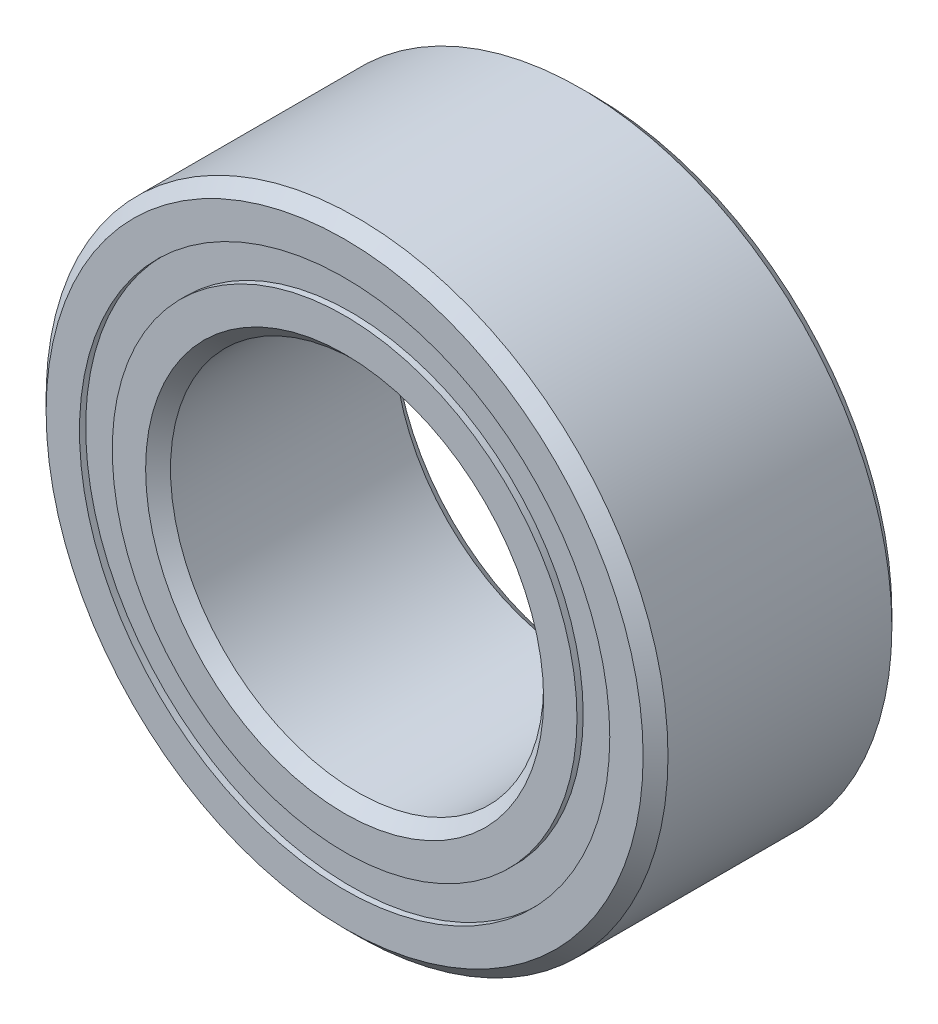
ISO-10303-21;
HEADER;
FILE_DESCRIPTION(('STEP AP214'),'2;1');
FILE_NAME('part.step','',(''),(''),'','','');
FILE_SCHEMA(('AUTOMOTIVE_DESIGN { 1 0 10303 214 1 1 1 1 }'));
ENDSEC;
DATA;
#1=APPLICATION_CONTEXT('core data for automotive mechanical design processes');
#2=APPLICATION_PROTOCOL_DEFINITION('international standard','automotive_design',2000,#1);
#3=PRODUCT_CONTEXT('',#1,'mechanical');
#4=PRODUCT('Part','Part','',(#3));
#5=PRODUCT_RELATED_PRODUCT_CATEGORY('part','',(#4));
#6=PRODUCT_DEFINITION_FORMATION('','',#4);
#7=PRODUCT_DEFINITION_CONTEXT('part definition',#1,'design');
#8=PRODUCT_DEFINITION('design','',#6,#7);
#9=PRODUCT_DEFINITION_SHAPE('','',#8);
#10=(LENGTH_UNIT() NAMED_UNIT(*) SI_UNIT(.MILLI.,.METRE.));
#11=(NAMED_UNIT(*) PLANE_ANGLE_UNIT() SI_UNIT($,.RADIAN.));
#12=(NAMED_UNIT(*) SI_UNIT($,.STERADIAN.) SOLID_ANGLE_UNIT());
#13=UNCERTAINTY_MEASURE_WITH_UNIT(LENGTH_MEASURE(1.E-05),#10,'distance_accuracy_value','');
#14=(GEOMETRIC_REPRESENTATION_CONTEXT(3) GLOBAL_UNCERTAINTY_ASSIGNED_CONTEXT((#13)) GLOBAL_UNIT_ASSIGNED_CONTEXT((#10,
#11,#12)) REPRESENTATION_CONTEXT('',''));
#15=CARTESIAN_POINT('',(0.,0.,0.));
#16=DIRECTION('',(0.,0.,1.));
#17=DIRECTION('',(1.,0.,0.));
#18=AXIS2_PLACEMENT_3D('',#15,#16,#17);
#19=CARTESIAN_POINT('',(0.,3.38434065934066,-1.508125));
#20=DIRECTION('',(0.,0.,1.));
#21=DIRECTION('',(1.,0.,0.));
#22=AXIS2_PLACEMENT_3D('',#19,#20,#21);
#23=PLANE('',#22);
#24=CARTESIAN_POINT('',(0.,0.,-1.508125));
#25=DIRECTION('',(0.,0.,1.));
#26=DIRECTION('',(1.,0.,0.));
#27=AXIS2_PLACEMENT_3D('',#24,#25,#26);
#28=CIRCLE('',#27,3.38434065934066);
#29=CARTESIAN_POINT('',(3.38434065934066,0.,-1.508125));
#30=VERTEX_POINT('',#29);
#31=EDGE_CURVE('E55',#30,#30,#28,.T.);
#32=ORIENTED_EDGE('',*,*,#31,.F.);
#33=EDGE_LOOP('',(#32));
#34=FACE_BOUND('',#33,.T.);
#35=CARTESIAN_POINT('',(0.,0.,-1.508125));
#36=DIRECTION('',(0.,0.,1.));
#37=DIRECTION('',(1.,0.,0.));
#38=AXIS2_PLACEMENT_3D('',#35,#36,#37);
#39=CIRCLE('',#38,2.96565934065934);
#40=CARTESIAN_POINT('',(2.96565934065934,0.,-1.508125));
#41=VERTEX_POINT('',#40);
#42=EDGE_CURVE('E11',#41,#41,#39,.T.);
#43=ORIENTED_EDGE('',*,*,#42,.T.);
#44=EDGE_LOOP('',(#43));
#45=FACE_BOUND('',#44,.T.);
#46=ADVANCED_FACE('F41',(#34,#45),#23,.F.);
#47=CARTESIAN_POINT('',(0.,0.,1.5875));
#48=DIRECTION('',(0.,0.,1.));
#49=DIRECTION('',(1.,0.,0.));
#50=AXIS2_PLACEMENT_3D('',#47,#48,#49);
#51=CYLINDRICAL_SURFACE('',#50,2.96565934065934);
#52=ORIENTED_EDGE('',*,*,#42,.F.);
#53=EDGE_LOOP('',(#52));
#54=FACE_BOUND('',#53,.T.);
#55=CARTESIAN_POINT('',(0.,0.,-0.735956624828183));
#56=DIRECTION('',(0.,0.,1.));
#57=DIRECTION('',(1.,0.,0.));
#58=AXIS2_PLACEMENT_3D('',#55,#56,#57);
#59=CIRCLE('',#58,2.96565934065934);
#60=CARTESIAN_POINT('',(2.96565934065934,0.,-0.735956624828183));
#61=VERTEX_POINT('',#60);
#62=EDGE_CURVE('E47',#61,#61,#59,.T.);
#63=ORIENTED_EDGE('',*,*,#62,.T.);
#64=EDGE_LOOP('',(#63));
#65=FACE_BOUND('',#64,.T.);
#66=ADVANCED_FACE('F64',(#54,#65),#51,.F.);
#67=CARTESIAN_POINT('',(0.,3.38434065934066,-0.735956624828183));
#68=DIRECTION('',(0.,0.,-1.));
#69=DIRECTION('',(-1.,0.,0.));
#70=AXIS2_PLACEMENT_3D('',#67,#68,#69);
#71=PLANE('',#70);
#72=ORIENTED_EDGE('',*,*,#62,.F.);
#73=EDGE_LOOP('',(#72));
#74=FACE_BOUND('',#73,.T.);
#75=CARTESIAN_POINT('',(0.,0.,-0.735956624828183));
#76=DIRECTION('',(0.,0.,1.));
#77=DIRECTION('',(1.,0.,0.));
#78=AXIS2_PLACEMENT_3D('',#75,#76,#77);
#79=CIRCLE('',#78,3.38434065934066);
#80=CARTESIAN_POINT('',(3.38434065934066,0.,-0.735956624828183));
#81=VERTEX_POINT('',#80);
#82=EDGE_CURVE('E51',#81,#81,#79,.T.);
#83=ORIENTED_EDGE('',*,*,#82,.T.);
#84=EDGE_LOOP('',(#83));
#85=FACE_BOUND('',#84,.T.);
#86=ADVANCED_FACE('F68',(#74,#85),#71,.F.);
#87=CARTESIAN_POINT('',(0.,0.,1.5875));
#88=DIRECTION('',(0.,0.,1.));
#89=DIRECTION('',(1.,0.,0.));
#90=AXIS2_PLACEMENT_3D('',#87,#88,#89);
#91=CYLINDRICAL_SURFACE('',#90,3.38434065934066);
#92=ORIENTED_EDGE('',*,*,#82,.F.);
#93=EDGE_LOOP('',(#92));
#94=FACE_BOUND('',#93,.T.);
#95=ORIENTED_EDGE('',*,*,#31,.T.);
#96=EDGE_LOOP('',(#95));
#97=FACE_BOUND('',#96,.T.);
#98=ADVANCED_FACE('F61',(#94,#97),#91,.T.);
#99=CLOSED_SHELL('',(#46,#66,#86,#98));
#100=MANIFOLD_SOLID_BREP('B2',#99);
#101=CARTESIAN_POINT('',(0.,3.38434065934066,1.508125));
#102=DIRECTION('',(0.,0.,-1.));
#103=DIRECTION('',(-1.,0.,0.));
#104=AXIS2_PLACEMENT_3D('',#101,#102,#103);
#105=PLANE('',#104);
#106=CARTESIAN_POINT('',(0.,0.,1.508125));
#107=DIRECTION('',(0.,0.,1.));
#108=DIRECTION('',(1.,0.,0.));
#109=AXIS2_PLACEMENT_3D('',#106,#107,#108);
#110=CIRCLE('',#109,2.96565934065934);
#111=CARTESIAN_POINT('',(2.96565934065934,0.,1.508125));
#112=VERTEX_POINT('',#111);
#113=EDGE_CURVE('E40',#112,#112,#110,.T.);
#114=ORIENTED_EDGE('',*,*,#113,.F.);
#115=EDGE_LOOP('',(#114));
#116=FACE_BOUND('',#115,.T.);
#117=CARTESIAN_POINT('',(0.,0.,1.508125));
#118=DIRECTION('',(0.,0.,1.));
#119=DIRECTION('',(1.,0.,0.));
#120=AXIS2_PLACEMENT_3D('',#117,#118,#119);
#121=CIRCLE('',#120,3.38434065934066);
#122=CARTESIAN_POINT('',(3.38434065934066,0.,1.508125));
#123=VERTEX_POINT('',#122);
#124=EDGE_CURVE('E122',#123,#123,#121,.T.);
#125=ORIENTED_EDGE('',*,*,#124,.T.);
#126=EDGE_LOOP('',(#125));
#127=FACE_BOUND('',#126,.T.);
#128=ADVANCED_FACE('F108',(#116,#127),#105,.F.);
#129=CARTESIAN_POINT('',(0.,0.,1.5875));
#130=DIRECTION('',(0.,0.,1.));
#131=DIRECTION('',(1.,0.,0.));
#132=AXIS2_PLACEMENT_3D('',#129,#130,#131);
#133=CYLINDRICAL_SURFACE('',#132,2.96565934065934);
#134=CARTESIAN_POINT('',(0.,0.,0.735956624828182));
#135=DIRECTION('',(0.,0.,1.));
#136=DIRECTION('',(1.,0.,0.));
#137=AXIS2_PLACEMENT_3D('',#134,#135,#136);
#138=CIRCLE('',#137,2.96565934065934);
#139=CARTESIAN_POINT('',(2.96565934065934,0.,0.735956624828182));
#140=VERTEX_POINT('',#139);
#141=EDGE_CURVE('E114',#140,#140,#138,.T.);
#142=ORIENTED_EDGE('',*,*,#141,.F.);
#143=EDGE_LOOP('',(#142));
#144=FACE_BOUND('',#143,.T.);
#145=ORIENTED_EDGE('',*,*,#113,.T.);
#146=EDGE_LOOP('',(#145));
#147=FACE_BOUND('',#146,.T.);
#148=ADVANCED_FACE('F137',(#144,#147),#133,.F.);
#149=CARTESIAN_POINT('',(0.,3.38434065934066,0.735956624828182));
#150=DIRECTION('',(0.,0.,1.));
#151=DIRECTION('',(1.,0.,0.));
#152=AXIS2_PLACEMENT_3D('',#149,#150,#151);
#153=PLANE('',#152);
#154=CARTESIAN_POINT('',(0.,0.,0.735956624828182));
#155=DIRECTION('',(0.,0.,1.));
#156=DIRECTION('',(1.,0.,0.));
#157=AXIS2_PLACEMENT_3D('',#154,#155,#156);
#158=CIRCLE('',#157,3.38434065934066);
#159=CARTESIAN_POINT('',(3.38434065934066,0.,0.735956624828182));
#160=VERTEX_POINT('',#159);
#161=EDGE_CURVE('E118',#160,#160,#158,.T.);
#162=ORIENTED_EDGE('',*,*,#161,.F.);
#163=EDGE_LOOP('',(#162));
#164=FACE_BOUND('',#163,.T.);
#165=ORIENTED_EDGE('',*,*,#141,.T.);
#166=EDGE_LOOP('',(#165));
#167=FACE_BOUND('',#166,.T.);
#168=ADVANCED_FACE('F132',(#164,#167),#153,.F.);
#169=CARTESIAN_POINT('',(0.,0.,1.5875));
#170=DIRECTION('',(0.,0.,1.));
#171=DIRECTION('',(1.,0.,0.));
#172=AXIS2_PLACEMENT_3D('',#169,#170,#171);
#173=CYLINDRICAL_SURFACE('',#172,3.38434065934066);
#174=ORIENTED_EDGE('',*,*,#124,.F.);
#175=EDGE_LOOP('',(#174));
#176=FACE_BOUND('',#175,.T.);
#177=ORIENTED_EDGE('',*,*,#161,.T.);
#178=EDGE_LOOP('',(#177));
#179=FACE_BOUND('',#178,.T.);
#180=ADVANCED_FACE('F129',(#176,#179),#173,.T.);
#181=CLOSED_SHELL('',(#128,#148,#168,#180));
#182=MANIFOLD_SOLID_BREP('B6',#181);
#183=CARTESIAN_POINT('',(-1.58749999999996,2.74963065701561,0.));
#184=DIRECTION('',(0.,0.,1.));
#185=DIRECTION('',(-0.499999999999989,0.866025403784445,0.));
#186=AXIS2_PLACEMENT_3D('',#183,#184,#185);
#187=SPHERICAL_SURFACE('',#186,0.735956624828183);
#188=CARTESIAN_POINT('',(-1.58749999999996,2.74963065701561,0.735956624828182));
#189=VERTEX_POINT('',#188);
#190=VERTEX_LOOP('',#189);
#191=FACE_BOUND('',#190,.T.);
#192=ADVANCED_FACE('F175',(#191),#187,.T.);
#193=CLOSED_SHELL('',(#192));
#194=MANIFOLD_SOLID_BREP('B35',#193);
#195=CARTESIAN_POINT('',(-2.74963065701557,1.58750000000003,0.));
#196=DIRECTION('',(0.,0.,1.));
#197=DIRECTION('',(-0.866025403784433,0.50000000000001,0.));
#198=AXIS2_PLACEMENT_3D('',#195,#196,#197);
#199=SPHERICAL_SURFACE('',#198,0.735956624828183);
#200=CARTESIAN_POINT('',(-2.74963065701557,1.58750000000003,0.735956624828182));
#201=VERTEX_POINT('',#200);
#202=VERTEX_LOOP('',#201);
#203=FACE_BOUND('',#202,.T.);
#204=ADVANCED_FACE('F195',(#203),#199,.T.);
#205=CLOSED_SHELL('',(#204));
#206=MANIFOLD_SOLID_BREP('B104',#205);
#207=CARTESIAN_POINT('',(-3.175,0.,0.));
#208=DIRECTION('',(0.,0.,1.));
#209=DIRECTION('',(-1.,0.,0.));
#210=AXIS2_PLACEMENT_3D('',#207,#208,#209);
#211=SPHERICAL_SURFACE('',#210,0.735956624828183);
#212=CARTESIAN_POINT('',(-3.175,0.,0.735956624828182));
#213=VERTEX_POINT('',#212);
#214=VERTEX_LOOP('',#213);
#215=FACE_BOUND('',#214,.T.);
#216=ADVANCED_FACE('F215',(#215),#211,.T.);
#217=CLOSED_SHELL('',(#216));
#218=MANIFOLD_SOLID_BREP('B171',#217);
#219=CARTESIAN_POINT('',(-2.74963065701561,-1.58749999999997,0.));
#220=DIRECTION('',(0.,0.,1.));
#221=DIRECTION('',(-0.866025403784443,-0.499999999999992,0.));
#222=AXIS2_PLACEMENT_3D('',#219,#220,#221);
#223=SPHERICAL_SURFACE('',#222,0.735956624828183);
#224=CARTESIAN_POINT('',(-2.74963065701561,-1.58749999999997,0.735956624828182));
#225=VERTEX_POINT('',#224);
#226=VERTEX_LOOP('',#225);
#227=FACE_BOUND('',#226,.T.);
#228=ADVANCED_FACE('F235',(#227),#223,.T.);
#229=CLOSED_SHELL('',(#228));
#230=MANIFOLD_SOLID_BREP('B191',#229);
#231=CARTESIAN_POINT('',(-1.58750000000002,-2.74963065701558,0.));
#232=DIRECTION('',(0.,0.,1.));
#233=DIRECTION('',(-0.500000000000007,-0.866025403784435,0.));
#234=AXIS2_PLACEMENT_3D('',#231,#232,#233);
#235=SPHERICAL_SURFACE('',#234,0.735956624828183);
#236=CARTESIAN_POINT('',(-1.58750000000002,-2.74963065701558,0.735956624828182));
#237=VERTEX_POINT('',#236);
#238=VERTEX_LOOP('',#237);
#239=FACE_BOUND('',#238,.T.);
#240=ADVANCED_FACE('F255',(#239),#235,.T.);
#241=CLOSED_SHELL('',(#240));
#242=MANIFOLD_SOLID_BREP('B211',#241);
#243=CARTESIAN_POINT('',(0.,-3.175,0.));
#244=DIRECTION('',(0.,0.,1.));
#245=DIRECTION('',(0.,-1.,0.));
#246=AXIS2_PLACEMENT_3D('',#243,#244,#245);
#247=SPHERICAL_SURFACE('',#246,0.735956624828183);
#248=CARTESIAN_POINT('',(0.,-3.175,0.735956624828182));
#249=VERTEX_POINT('',#248);
#250=VERTEX_LOOP('',#249);
#251=FACE_BOUND('',#250,.T.);
#252=ADVANCED_FACE('F275',(#251),#247,.T.);
#253=CLOSED_SHELL('',(#252));
#254=MANIFOLD_SOLID_BREP('B231',#253);
#255=CARTESIAN_POINT('',(1.58749999999998,-2.7496306570156,0.));
#256=DIRECTION('',(0.,0.,1.));
#257=DIRECTION('',(0.499999999999995,-0.866025403784442,0.));
#258=AXIS2_PLACEMENT_3D('',#255,#256,#257);
#259=SPHERICAL_SURFACE('',#258,0.735956624828183);
#260=CARTESIAN_POINT('',(1.58749999999998,-2.7496306570156,0.735956624828182));
#261=VERTEX_POINT('',#260);
#262=VERTEX_LOOP('',#261);
#263=FACE_BOUND('',#262,.T.);
#264=ADVANCED_FACE('F295',(#263),#259,.T.);
#265=CLOSED_SHELL('',(#264));
#266=MANIFOLD_SOLID_BREP('B251',#265);
#267=CARTESIAN_POINT('',(2.74963065701559,-1.58750000000001,0.));
#268=DIRECTION('',(0.,0.,1.));
#269=DIRECTION('',(0.866025403784436,-0.500000000000004,0.));
#270=AXIS2_PLACEMENT_3D('',#267,#268,#269);
#271=SPHERICAL_SURFACE('',#270,0.735956624828183);
#272=CARTESIAN_POINT('',(2.74963065701559,-1.58750000000001,0.735956624828182));
#273=VERTEX_POINT('',#272);
#274=VERTEX_LOOP('',#273);
#275=FACE_BOUND('',#274,.T.);
#276=ADVANCED_FACE('F315',(#275),#271,.T.);
#277=CLOSED_SHELL('',(#276));
#278=MANIFOLD_SOLID_BREP('B271',#277);
#279=CARTESIAN_POINT('',(3.175,0.,0.));
#280=DIRECTION('',(0.,0.,1.));
#281=DIRECTION('',(1.,0.,0.));
#282=AXIS2_PLACEMENT_3D('',#279,#280,#281);
#283=SPHERICAL_SURFACE('',#282,0.735956624828183);
#284=CARTESIAN_POINT('',(3.175,0.,0.735956624828182));
#285=VERTEX_POINT('',#284);
#286=VERTEX_LOOP('',#285);
#287=FACE_BOUND('',#286,.T.);
#288=ADVANCED_FACE('F335',(#287),#283,.T.);
#289=CLOSED_SHELL('',(#288));
#290=MANIFOLD_SOLID_BREP('B291',#289);
#291=CARTESIAN_POINT('',(2.7496306570156,1.58749999999999,0.));
#292=DIRECTION('',(0.,0.,1.));
#293=DIRECTION('',(0.86602540378444,0.499999999999998,0.));
#294=AXIS2_PLACEMENT_3D('',#291,#292,#293);
#295=SPHERICAL_SURFACE('',#294,0.735956624828183);
#296=CARTESIAN_POINT('',(2.7496306570156,1.58749999999999,0.735956624828182));
#297=VERTEX_POINT('',#296);
#298=VERTEX_LOOP('',#297);
#299=FACE_BOUND('',#298,.T.);
#300=ADVANCED_FACE('F355',(#299),#295,.T.);
#301=CLOSED_SHELL('',(#300));
#302=MANIFOLD_SOLID_BREP('B311',#301);
#303=CARTESIAN_POINT('',(1.5875,2.74963065701559,0.));
#304=DIRECTION('',(0.,0.,1.));
#305=DIRECTION('',(0.500000000000001,0.866025403784438,0.));
#306=AXIS2_PLACEMENT_3D('',#303,#304,#305);
#307=SPHERICAL_SURFACE('',#306,0.735956624828183);
#308=CARTESIAN_POINT('',(1.5875,2.74963065701559,0.735956624828182));
#309=VERTEX_POINT('',#308);
#310=VERTEX_LOOP('',#309);
#311=FACE_BOUND('',#310,.T.);
#312=ADVANCED_FACE('F375',(#311),#307,.T.);
#313=CLOSED_SHELL('',(#312));
#314=MANIFOLD_SOLID_BREP('B331',#313);
#315=CARTESIAN_POINT('',(0.,3.175,0.));
#316=DIRECTION('',(0.,0.,1.));
#317=DIRECTION('',(0.,1.,0.));
#318=AXIS2_PLACEMENT_3D('',#315,#316,#317);
#319=SPHERICAL_SURFACE('',#318,0.735956624828183);
#320=CARTESIAN_POINT('',(0.,3.175,0.735956624828182));
#321=VERTEX_POINT('',#320);
#322=VERTEX_LOOP('',#321);
#323=FACE_BOUND('',#322,.T.);
#324=ADVANCED_FACE('F397',(#323),#319,.T.);
#325=CLOSED_SHELL('',(#324));
#326=MANIFOLD_SOLID_BREP('B351',#325);
#327=CARTESIAN_POINT('',(0.,2.96565934065934,1.5875));
#328=DIRECTION('',(0.,0.,-1.));
#329=DIRECTION('',(-1.,0.,0.));
#330=AXIS2_PLACEMENT_3D('',#327,#328,#329);
#331=PLANE('',#330);
#332=CARTESIAN_POINT('',(0.,0.,1.5875));
#333=DIRECTION('',(0.,0.,1.));
#334=DIRECTION('',(1.,0.,0.));
#335=AXIS2_PLACEMENT_3D('',#332,#333,#334);
#336=CIRCLE('',#335,2.54);
#337=CARTESIAN_POINT('',(2.54,0.,1.5875));
#338=VERTEX_POINT('',#337);
#339=EDGE_CURVE('E444',#338,#338,#336,.T.);
#340=ORIENTED_EDGE('',*,*,#339,.F.);
#341=EDGE_LOOP('',(#340));
#342=FACE_BOUND('',#341,.T.);
#343=CARTESIAN_POINT('',(0.,0.,1.5875));
#344=DIRECTION('',(0.,0.,1.));
#345=DIRECTION('',(1.,0.,0.));
#346=AXIS2_PLACEMENT_3D('',#343,#344,#345);
#347=CIRCLE('',#346,2.96565934065934);
#348=CARTESIAN_POINT('',(2.96565934065934,0.,1.5875));
#349=VERTEX_POINT('',#348);
#350=EDGE_CURVE('E396',#349,#349,#347,.T.);
#351=ORIENTED_EDGE('',*,*,#350,.T.);
#352=EDGE_LOOP('',(#351));
#353=FACE_BOUND('',#352,.T.);
#354=ADVANCED_FACE('F416',(#342,#353),#331,.F.);
#355=CARTESIAN_POINT('',(0.,0.,1.5875));
#356=DIRECTION('',(0.,0.,1.));
#357=DIRECTION('',(1.,0.,0.));
#358=AXIS2_PLACEMENT_3D('',#355,#356,#357);
#359=CYLINDRICAL_SURFACE('',#358,2.96565934065934);
#360=ORIENTED_EDGE('',*,*,#350,.F.);
#361=EDGE_LOOP('',(#360));
#362=FACE_BOUND('',#361,.T.);
#363=CARTESIAN_POINT('',(0.,0.,0.705555555555555));
#364=DIRECTION('',(0.,0.,1.));
#365=DIRECTION('',(1.,0.,0.));
#366=AXIS2_PLACEMENT_3D('',#363,#364,#365);
#367=CIRCLE('',#366,2.96565934065934);
#368=CARTESIAN_POINT('',(2.96565934065934,0.,0.705555555555555));
#369=VERTEX_POINT('',#368);
#370=EDGE_CURVE('E422',#369,#369,#367,.T.);
#371=ORIENTED_EDGE('',*,*,#370,.T.);
#372=EDGE_LOOP('',(#371));
#373=FACE_BOUND('',#372,.T.);
#374=ADVANCED_FACE('F451',(#362,#373),#359,.T.);
#375=CARTESIAN_POINT('',(0.,0.,0.));
#376=DIRECTION('',(0.,0.,1.));
#377=DIRECTION('',(1.,0.,0.));
#378=AXIS2_PLACEMENT_3D('',#375,#376,#377);
#379=TOROIDAL_SURFACE('',#378,3.175,0.735956624828181);
#380=ORIENTED_EDGE('',*,*,#370,.F.);
#381=EDGE_LOOP('',(#380));
#382=FACE_BOUND('',#381,.T.);
#383=CARTESIAN_POINT('',(0.,0.,-0.705555555555556));
#384=DIRECTION('',(0.,0.,1.));
#385=DIRECTION('',(1.,0.,0.));
#386=AXIS2_PLACEMENT_3D('',#383,#384,#385);
#387=CIRCLE('',#386,2.96565934065934);
#388=CARTESIAN_POINT('',(2.96565934065934,0.,-0.705555555555556));
#389=VERTEX_POINT('',#388);
#390=EDGE_CURVE('E426',#389,#389,#387,.T.);
#391=ORIENTED_EDGE('',*,*,#390,.T.);
#392=EDGE_LOOP('',(#391));
#393=FACE_BOUND('',#392,.T.);
#394=ADVANCED_FACE('F455',(#382,#393),#379,.F.);
#395=CARTESIAN_POINT('',(0.,0.,1.5875));
#396=DIRECTION('',(0.,0.,1.));
#397=DIRECTION('',(1.,0.,0.));
#398=AXIS2_PLACEMENT_3D('',#395,#396,#397);
#399=CYLINDRICAL_SURFACE('',#398,2.96565934065934);
#400=ORIENTED_EDGE('',*,*,#390,.F.);
#401=EDGE_LOOP('',(#400));
#402=FACE_BOUND('',#401,.T.);
#403=CARTESIAN_POINT('',(0.,0.,-1.5875));
#404=DIRECTION('',(0.,0.,1.));
#405=DIRECTION('',(1.,0.,0.));
#406=AXIS2_PLACEMENT_3D('',#403,#404,#405);
#407=CIRCLE('',#406,2.96565934065934);
#408=CARTESIAN_POINT('',(2.96565934065934,0.,-1.5875));
#409=VERTEX_POINT('',#408);
#410=EDGE_CURVE('E430',#409,#409,#407,.T.);
#411=ORIENTED_EDGE('',*,*,#410,.T.);
#412=EDGE_LOOP('',(#411));
#413=FACE_BOUND('',#412,.T.);
#414=ADVANCED_FACE('F460',(#402,#413),#399,.T.);
#415=CARTESIAN_POINT('',(0.,2.54,-1.5875));
#416=DIRECTION('',(0.,0.,1.));
#417=DIRECTION('',(1.,0.,0.));
#418=AXIS2_PLACEMENT_3D('',#415,#416,#417);
#419=PLANE('',#418);
#420=ORIENTED_EDGE('',*,*,#410,.F.);
#421=EDGE_LOOP('',(#420));
#422=FACE_BOUND('',#421,.T.);
#423=CARTESIAN_POINT('',(0.,0.,-1.5875));
#424=DIRECTION('',(0.,0.,1.));
#425=DIRECTION('',(1.,0.,0.));
#426=AXIS2_PLACEMENT_3D('',#423,#424,#425);
#427=CIRCLE('',#426,2.54);
#428=CARTESIAN_POINT('',(2.54,0.,-1.5875));
#429=VERTEX_POINT('',#428);
#430=EDGE_CURVE('E435',#429,#429,#427,.T.);
#431=ORIENTED_EDGE('',*,*,#430,.T.);
#432=EDGE_LOOP('',(#431));
#433=FACE_BOUND('',#432,.T.);
#434=ADVANCED_FACE('F466',(#422,#433),#419,.F.);
#435=CARTESIAN_POINT('',(0.,0.,-1.42875));
#436=DIRECTION('',(0.,0.,-1.));
#437=DIRECTION('',(-1.,0.,0.));
#438=AXIS2_PLACEMENT_3D('',#435,#436,#437);
#439=CONICAL_SURFACE('',#438,2.38125,0.785398163397448);
#440=ORIENTED_EDGE('',*,*,#430,.F.);
#441=EDGE_LOOP('',(#440));
#442=FACE_BOUND('',#441,.T.);
#443=CARTESIAN_POINT('',(0.,0.,-1.42875));
#444=DIRECTION('',(0.,0.,1.));
#445=DIRECTION('',(1.,0.,0.));
#446=AXIS2_PLACEMENT_3D('',#443,#444,#445);
#447=CIRCLE('',#446,2.38125);
#448=CARTESIAN_POINT('',(2.38125,0.,-1.42875));
#449=VERTEX_POINT('',#448);
#450=EDGE_CURVE('E438',#449,#449,#447,.T.);
#451=ORIENTED_EDGE('',*,*,#450,.T.);
#452=EDGE_LOOP('',(#451));
#453=FACE_BOUND('',#452,.T.);
#454=ADVANCED_FACE('F470',(#442,#453),#439,.F.);
#455=CARTESIAN_POINT('',(0.,0.,1.5875));
#456=DIRECTION('',(0.,0.,1.));
#457=DIRECTION('',(1.,0.,0.));
#458=AXIS2_PLACEMENT_3D('',#455,#456,#457);
#459=CYLINDRICAL_SURFACE('',#458,2.38125);
#460=ORIENTED_EDGE('',*,*,#450,.F.);
#461=EDGE_LOOP('',(#460));
#462=FACE_BOUND('',#461,.T.);
#463=CARTESIAN_POINT('',(0.,0.,1.42875));
#464=DIRECTION('',(0.,0.,1.));
#465=DIRECTION('',(1.,0.,0.));
#466=AXIS2_PLACEMENT_3D('',#463,#464,#465);
#467=CIRCLE('',#466,2.38125);
#468=CARTESIAN_POINT('',(2.38125,0.,1.42875));
#469=VERTEX_POINT('',#468);
#470=EDGE_CURVE('E441',#469,#469,#467,.T.);
#471=ORIENTED_EDGE('',*,*,#470,.T.);
#472=EDGE_LOOP('',(#471));
#473=FACE_BOUND('',#472,.T.);
#474=ADVANCED_FACE('F474',(#462,#473),#459,.F.);
#475=CARTESIAN_POINT('',(0.,0.,1.5875));
#476=DIRECTION('',(0.,0.,1.));
#477=DIRECTION('',(1.,0.,0.));
#478=AXIS2_PLACEMENT_3D('',#475,#476,#477);
#479=CONICAL_SURFACE('',#478,2.54,0.785398163397449);
#480=ORIENTED_EDGE('',*,*,#470,.F.);
#481=EDGE_LOOP('',(#480));
#482=FACE_BOUND('',#481,.T.);
#483=ORIENTED_EDGE('',*,*,#339,.T.);
#484=EDGE_LOOP('',(#483));
#485=FACE_BOUND('',#484,.T.);
#486=ADVANCED_FACE('F448',(#482,#485),#479,.F.);
#487=CLOSED_SHELL('',(#354,#374,#394,#414,#434,#454,#474,#486));
#488=MANIFOLD_SOLID_BREP('B371',#487);
#489=CARTESIAN_POINT('',(0.,0.,1.42875));
#490=DIRECTION('',(0.,0.,-1.));
#491=DIRECTION('',(-1.,0.,0.));
#492=AXIS2_PLACEMENT_3D('',#489,#490,#491);
#493=CONICAL_SURFACE('',#492,3.96875,0.785398163397448);
#494=CARTESIAN_POINT('',(0.,0.,1.5875));
#495=DIRECTION('',(0.,0.,1.));
#496=DIRECTION('',(1.,0.,0.));
#497=AXIS2_PLACEMENT_3D('',#494,#495,#496);
#498=CIRCLE('',#497,3.81);
#499=CARTESIAN_POINT('',(3.81,0.,1.5875));
#500=VERTEX_POINT('',#499);
#501=EDGE_CURVE('E565',#500,#500,#498,.T.);
#502=ORIENTED_EDGE('',*,*,#501,.F.);
#503=EDGE_LOOP('',(#502));
#504=FACE_BOUND('',#503,.T.);
#505=CARTESIAN_POINT('',(0.,0.,1.42875));
#506=DIRECTION('',(0.,0.,1.));
#507=DIRECTION('',(1.,0.,0.));
#508=AXIS2_PLACEMENT_3D('',#505,#506,#507);
#509=CIRCLE('',#508,3.96875);
#510=CARTESIAN_POINT('',(3.96875,0.,1.42875));
#511=VERTEX_POINT('',#510);
#512=EDGE_CURVE('E415',#511,#511,#509,.T.);
#513=ORIENTED_EDGE('',*,*,#512,.T.);
#514=EDGE_LOOP('',(#513));
#515=FACE_BOUND('',#514,.T.);
#516=ADVANCED_FACE('F537',(#504,#515),#493,.T.);
#517=CARTESIAN_POINT('',(0.,0.,1.5875));
#518=DIRECTION('',(0.,0.,1.));
#519=DIRECTION('',(1.,0.,0.));
#520=AXIS2_PLACEMENT_3D('',#517,#518,#519);
#521=CYLINDRICAL_SURFACE('',#520,3.96875);
#522=ORIENTED_EDGE('',*,*,#512,.F.);
#523=EDGE_LOOP('',(#522));
#524=FACE_BOUND('',#523,.T.);
#525=CARTESIAN_POINT('',(0.,0.,-1.42875));
#526=DIRECTION('',(0.,0.,1.));
#527=DIRECTION('',(1.,0.,0.));
#528=AXIS2_PLACEMENT_3D('',#525,#526,#527);
#529=CIRCLE('',#528,3.96875);
#530=CARTESIAN_POINT('',(3.96875,0.,-1.42875));
#531=VERTEX_POINT('',#530);
#532=EDGE_CURVE('E543',#531,#531,#529,.T.);
#533=ORIENTED_EDGE('',*,*,#532,.T.);
#534=EDGE_LOOP('',(#533));
#535=FACE_BOUND('',#534,.T.);
#536=ADVANCED_FACE('F572',(#524,#535),#521,.T.);
#537=CARTESIAN_POINT('',(0.,0.,-1.5875));
#538=DIRECTION('',(0.,0.,1.));
#539=DIRECTION('',(1.,0.,0.));
#540=AXIS2_PLACEMENT_3D('',#537,#538,#539);
#541=CONICAL_SURFACE('',#540,3.81,0.785398163397447);
#542=ORIENTED_EDGE('',*,*,#532,.F.);
#543=EDGE_LOOP('',(#542));
#544=FACE_BOUND('',#543,.T.);
#545=CARTESIAN_POINT('',(0.,0.,-1.5875));
#546=DIRECTION('',(0.,0.,1.));
#547=DIRECTION('',(1.,0.,0.));
#548=AXIS2_PLACEMENT_3D('',#545,#546,#547);
#549=CIRCLE('',#548,3.81);
#550=CARTESIAN_POINT('',(3.81,0.,-1.5875));
#551=VERTEX_POINT('',#550);
#552=EDGE_CURVE('E547',#551,#551,#549,.T.);
#553=ORIENTED_EDGE('',*,*,#552,.T.);
#554=EDGE_LOOP('',(#553));
#555=FACE_BOUND('',#554,.T.);
#556=ADVANCED_FACE('F576',(#544,#555),#541,.T.);
#557=CARTESIAN_POINT('',(0.,3.81,-1.5875));
#558=DIRECTION('',(0.,0.,1.));
#559=DIRECTION('',(1.,0.,0.));
#560=AXIS2_PLACEMENT_3D('',#557,#558,#559);
#561=PLANE('',#560);
#562=ORIENTED_EDGE('',*,*,#552,.F.);
#563=EDGE_LOOP('',(#562));
#564=FACE_BOUND('',#563,.T.);
#565=CARTESIAN_POINT('',(0.,0.,-1.5875));
#566=DIRECTION('',(0.,0.,1.));
#567=DIRECTION('',(1.,0.,0.));
#568=AXIS2_PLACEMENT_3D('',#565,#566,#567);
#569=CIRCLE('',#568,3.38434065934066);
#570=CARTESIAN_POINT('',(3.38434065934066,0.,-1.5875));
#571=VERTEX_POINT('',#570);
#572=EDGE_CURVE('E551',#571,#571,#569,.T.);
#573=ORIENTED_EDGE('',*,*,#572,.T.);
#574=EDGE_LOOP('',(#573));
#575=FACE_BOUND('',#574,.T.);
#576=ADVANCED_FACE('F581',(#564,#575),#561,.F.);
#577=CARTESIAN_POINT('',(0.,0.,1.5875));
#578=DIRECTION('',(0.,0.,1.));
#579=DIRECTION('',(1.,0.,0.));
#580=AXIS2_PLACEMENT_3D('',#577,#578,#579);
#581=CYLINDRICAL_SURFACE('',#580,3.38434065934066);
#582=ORIENTED_EDGE('',*,*,#572,.F.);
#583=EDGE_LOOP('',(#582));
#584=FACE_BOUND('',#583,.T.);
#585=CARTESIAN_POINT('',(0.,0.,-0.705555555555556));
#586=DIRECTION('',(0.,0.,1.));
#587=DIRECTION('',(1.,0.,0.));
#588=AXIS2_PLACEMENT_3D('',#585,#586,#587);
#589=CIRCLE('',#588,3.38434065934066);
#590=CARTESIAN_POINT('',(3.38434065934066,0.,-0.705555555555556));
#591=VERTEX_POINT('',#590);
#592=EDGE_CURVE('E556',#591,#591,#589,.T.);
#593=ORIENTED_EDGE('',*,*,#592,.T.);
#594=EDGE_LOOP('',(#593));
#595=FACE_BOUND('',#594,.T.);
#596=ADVANCED_FACE('F587',(#584,#595),#581,.F.);
#597=CARTESIAN_POINT('',(0.,0.,0.));
#598=DIRECTION('',(0.,0.,1.));
#599=DIRECTION('',(1.,0.,0.));
#600=AXIS2_PLACEMENT_3D('',#597,#598,#599);
#601=TOROIDAL_SURFACE('',#600,3.175,0.735956624828183);
#602=ORIENTED_EDGE('',*,*,#592,.F.);
#603=EDGE_LOOP('',(#602));
#604=FACE_BOUND('',#603,.T.);
#605=CARTESIAN_POINT('',(0.,0.,0.705555555555555));
#606=DIRECTION('',(0.,0.,1.));
#607=DIRECTION('',(1.,0.,0.));
#608=AXIS2_PLACEMENT_3D('',#605,#606,#607);
#609=CIRCLE('',#608,3.38434065934066);
#610=CARTESIAN_POINT('',(3.38434065934066,0.,0.705555555555555));
#611=VERTEX_POINT('',#610);
#612=EDGE_CURVE('E559',#611,#611,#609,.T.);
#613=ORIENTED_EDGE('',*,*,#612,.T.);
#614=EDGE_LOOP('',(#613));
#615=FACE_BOUND('',#614,.T.);
#616=ADVANCED_FACE('F591',(#604,#615),#601,.F.);
#617=CARTESIAN_POINT('',(0.,0.,1.5875));
#618=DIRECTION('',(0.,0.,1.));
#619=DIRECTION('',(1.,0.,0.));
#620=AXIS2_PLACEMENT_3D('',#617,#618,#619);
#621=CYLINDRICAL_SURFACE('',#620,3.38434065934066);
#622=ORIENTED_EDGE('',*,*,#612,.F.);
#623=EDGE_LOOP('',(#622));
#624=FACE_BOUND('',#623,.T.);
#625=CARTESIAN_POINT('',(0.,0.,1.5875));
#626=DIRECTION('',(0.,0.,1.));
#627=DIRECTION('',(1.,0.,0.));
#628=AXIS2_PLACEMENT_3D('',#625,#626,#627);
#629=CIRCLE('',#628,3.38434065934066);
#630=CARTESIAN_POINT('',(3.38434065934066,0.,1.5875));
#631=VERTEX_POINT('',#630);
#632=EDGE_CURVE('E562',#631,#631,#629,.T.);
#633=ORIENTED_EDGE('',*,*,#632,.T.);
#634=EDGE_LOOP('',(#633));
#635=FACE_BOUND('',#634,.T.);
#636=ADVANCED_FACE('F595',(#624,#635),#621,.F.);
#637=CARTESIAN_POINT('',(0.,3.81,1.5875));
#638=DIRECTION('',(0.,0.,-1.));
#639=DIRECTION('',(-1.,0.,0.));
#640=AXIS2_PLACEMENT_3D('',#637,#638,#639);
#641=PLANE('',#640);
#642=ORIENTED_EDGE('',*,*,#632,.F.);
#643=EDGE_LOOP('',(#642));
#644=FACE_BOUND('',#643,.T.);
#645=ORIENTED_EDGE('',*,*,#501,.T.);
#646=EDGE_LOOP('',(#645));
#647=FACE_BOUND('',#646,.T.);
#648=ADVANCED_FACE('F569',(#644,#647),#641,.F.);
#649=CLOSED_SHELL('',(#516,#536,#556,#576,#596,#616,#636,#648));
#650=MANIFOLD_SOLID_BREP('B391',#649);
#651=ADVANCED_BREP_SHAPE_REPRESENTATION('',(#18,#100,#182,#194,#206,#218,#230,#242,#254,#266,
#278,#290,#302,#314,#326,#488,#650),#14);
#652=SHAPE_DEFINITION_REPRESENTATION(#9,#651);
ENDSEC;
END-ISO-10303-21;
